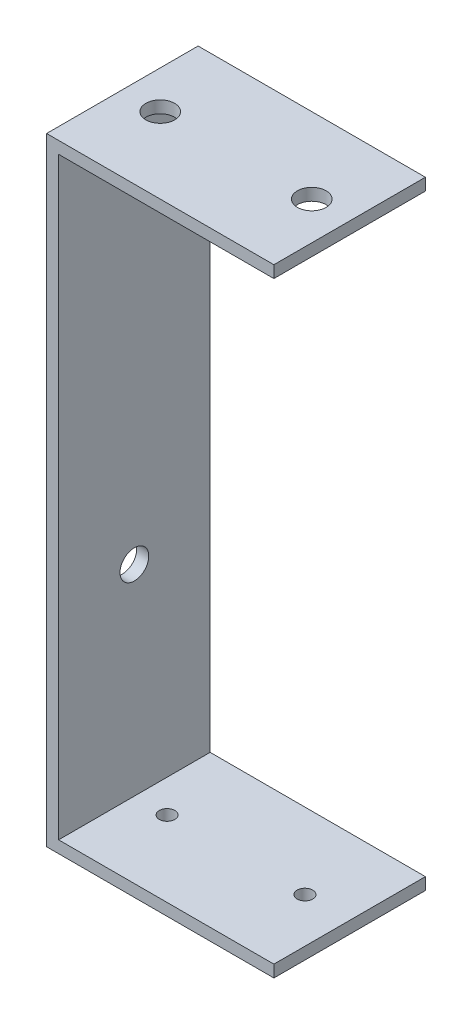
ISO-10303-21;
HEADER;
FILE_DESCRIPTION(('STEP AP214'),'2;1');
FILE_NAME('part.step','',(''),(''),'','','');
FILE_SCHEMA(('AUTOMOTIVE_DESIGN { 1 0 10303 214 1 1 1 1 }'));
ENDSEC;
DATA;
#1=APPLICATION_CONTEXT('core data for automotive mechanical design processes');
#2=APPLICATION_PROTOCOL_DEFINITION('international standard','automotive_design',2000,#1);
#3=PRODUCT_CONTEXT('',#1,'mechanical');
#4=PRODUCT('Part','Part','',(#3));
#5=PRODUCT_RELATED_PRODUCT_CATEGORY('part','',(#4));
#6=PRODUCT_DEFINITION_FORMATION('','',#4);
#7=PRODUCT_DEFINITION_CONTEXT('part definition',#1,'design');
#8=PRODUCT_DEFINITION('design','',#6,#7);
#9=PRODUCT_DEFINITION_SHAPE('','',#8);
#10=(LENGTH_UNIT() NAMED_UNIT(*) SI_UNIT(.MILLI.,.METRE.));
#11=(NAMED_UNIT(*) PLANE_ANGLE_UNIT() SI_UNIT($,.RADIAN.));
#12=(NAMED_UNIT(*) SI_UNIT($,.STERADIAN.) SOLID_ANGLE_UNIT());
#13=UNCERTAINTY_MEASURE_WITH_UNIT(LENGTH_MEASURE(1.E-05),#10,'distance_accuracy_value','');
#14=(GEOMETRIC_REPRESENTATION_CONTEXT(3) GLOBAL_UNCERTAINTY_ASSIGNED_CONTEXT((#13)) GLOBAL_UNIT_ASSIGNED_CONTEXT((#10,
#11,#12)) REPRESENTATION_CONTEXT('',''));
#15=CARTESIAN_POINT('',(0.,0.,0.));
#16=DIRECTION('',(0.,0.,1.));
#17=DIRECTION('',(1.,0.,0.));
#18=AXIS2_PLACEMENT_3D('',#15,#16,#17);
#19=CARTESIAN_POINT('',(30.,1.5875,20.));
#20=DIRECTION('',(0.,-1.,0.));
#21=DIRECTION('',(1.,0.,0.));
#22=AXIS2_PLACEMENT_3D('',#19,#20,#21);
#23=PLANE('',#22);
#24=DIRECTION('',(-1.,0.,0.));
#25=VECTOR('',#24,1.);
#26=CARTESIAN_POINT('',(30.,1.5875,0.));
#27=LINE('',#26,#25);
#28=CARTESIAN_POINT('',(30.,1.5875,0.));
#29=VERTEX_POINT('',#28);
#30=CARTESIAN_POINT('',(1.5875,1.5875,0.));
#31=VERTEX_POINT('',#30);
#32=EDGE_CURVE('E135',#29,#31,#27,.T.);
#33=ORIENTED_EDGE('',*,*,#32,.T.);
#34=DIRECTION('',(0.,0.,-1.));
#35=VECTOR('',#34,1.);
#36=CARTESIAN_POINT('',(1.5875,1.5875,20.));
#37=LINE('',#36,#35);
#38=CARTESIAN_POINT('',(1.5875,1.5875,20.));
#39=VERTEX_POINT('',#38);
#40=EDGE_CURVE('E44',#39,#31,#37,.T.);
#41=ORIENTED_EDGE('',*,*,#40,.F.);
#42=DIRECTION('',(-1.,0.,0.));
#43=VECTOR('',#42,1.);
#44=CARTESIAN_POINT('',(30.,1.5875,20.));
#45=LINE('',#44,#43);
#46=CARTESIAN_POINT('',(30.,1.5875,20.));
#47=VERTEX_POINT('',#46);
#48=EDGE_CURVE('E95',#47,#39,#45,.T.);
#49=ORIENTED_EDGE('',*,*,#48,.F.);
#50=DIRECTION('',(0.,0.,-1.));
#51=VECTOR('',#50,1.);
#52=CARTESIAN_POINT('',(30.,1.5875,20.));
#53=LINE('',#52,#51);
#54=EDGE_CURVE('E11',#47,#29,#53,.T.);
#55=ORIENTED_EDGE('',*,*,#54,.T.);
#56=EDGE_LOOP('',(#33,#41,#49,#55));
#57=FACE_BOUND('',#56,.T.);
#58=CARTESIAN_POINT('',(24.1,1.5875,10.));
#59=DIRECTION('',(0.,-1.,0.));
#60=DIRECTION('',(1.,0.,0.));
#61=AXIS2_PLACEMENT_3D('',#58,#59,#60);
#62=CIRCLE('',#61,1.0287);
#63=CARTESIAN_POINT('',(25.1287,1.5875,10.));
#64=VERTEX_POINT('',#63);
#65=EDGE_CURVE('E189',#64,#64,#62,.F.);
#66=ORIENTED_EDGE('',*,*,#65,.F.);
#67=EDGE_LOOP('',(#66));
#68=FACE_BOUND('',#67,.T.);
#69=CARTESIAN_POINT('',(5.9,1.5875,10.));
#70=DIRECTION('',(0.,-1.,0.));
#71=DIRECTION('',(1.,0.,0.));
#72=AXIS2_PLACEMENT_3D('',#69,#70,#71);
#73=CIRCLE('',#72,1.0287);
#74=CARTESIAN_POINT('',(6.9287,1.5875,10.));
#75=VERTEX_POINT('',#74);
#76=EDGE_CURVE('E195',#75,#75,#73,.F.);
#77=ORIENTED_EDGE('',*,*,#76,.F.);
#78=EDGE_LOOP('',(#77));
#79=FACE_BOUND('',#78,.T.);
#80=ADVANCED_FACE('F35',(#57,#68,#79),#23,.F.);
#81=CARTESIAN_POINT('',(30.,1.5875,20.));
#82=DIRECTION('',(-1.,0.,0.));
#83=DIRECTION('',(0.,0.,1.));
#84=AXIS2_PLACEMENT_3D('',#81,#82,#83);
#85=PLANE('',#84);
#86=DIRECTION('',(0.,1.,0.));
#87=VECTOR('',#86,1.);
#88=CARTESIAN_POINT('',(30.,1.5875,0.));
#89=LINE('',#88,#87);
#90=CARTESIAN_POINT('',(30.,0.,0.));
#91=VERTEX_POINT('',#90);
#92=EDGE_CURVE('E132',#91,#29,#89,.T.);
#93=ORIENTED_EDGE('',*,*,#92,.T.);
#94=ORIENTED_EDGE('',*,*,#54,.F.);
#95=DIRECTION('',(0.,1.,0.));
#96=VECTOR('',#95,1.);
#97=CARTESIAN_POINT('',(30.,1.5875,20.));
#98=LINE('',#97,#96);
#99=CARTESIAN_POINT('',(30.,0.,20.));
#100=VERTEX_POINT('',#99);
#101=EDGE_CURVE('E147',#100,#47,#98,.T.);
#102=ORIENTED_EDGE('',*,*,#101,.F.);
#103=DIRECTION('',(0.,0.,-1.));
#104=VECTOR('',#103,1.);
#105=CARTESIAN_POINT('',(30.,0.,20.));
#106=LINE('',#105,#104);
#107=EDGE_CURVE('E128',#100,#91,#106,.T.);
#108=ORIENTED_EDGE('',*,*,#107,.T.);
#109=EDGE_LOOP('',(#93,#94,#102,#108));
#110=FACE_BOUND('',#109,.T.);
#111=ADVANCED_FACE('F37',(#110),#85,.F.);
#112=CARTESIAN_POINT('',(1.5875,1.5875,20.));
#113=DIRECTION('',(-1.,0.,0.));
#114=DIRECTION('',(0.,0.,1.));
#115=AXIS2_PLACEMENT_3D('',#112,#113,#114);
#116=PLANE('',#115);
#117=CARTESIAN_POINT('',(1.5875,28.08,10.));
#118=DIRECTION('',(-1.,0.,0.));
#119=DIRECTION('',(0.,0.,1.));
#120=AXIS2_PLACEMENT_3D('',#117,#118,#119);
#121=CIRCLE('',#120,1.89865);
#122=CARTESIAN_POINT('',(1.5875,28.08,11.89865));
#123=VERTEX_POINT('',#122);
#124=EDGE_CURVE('E201',#123,#123,#121,.F.);
#125=ORIENTED_EDGE('',*,*,#124,.F.);
#126=EDGE_LOOP('',(#125));
#127=FACE_BOUND('',#126,.T.);
#128=DIRECTION('',(0.,1.,0.));
#129=VECTOR('',#128,1.);
#130=CARTESIAN_POINT('',(1.5875,1.5875,0.));
#131=LINE('',#130,#129);
#132=CARTESIAN_POINT('',(1.5875,79.9525,0.));
#133=VERTEX_POINT('',#132);
#134=EDGE_CURVE('E138',#31,#133,#131,.T.);
#135=ORIENTED_EDGE('',*,*,#134,.T.);
#136=DIRECTION('',(0.,0.,-1.));
#137=VECTOR('',#136,1.);
#138=CARTESIAN_POINT('',(1.5875,79.9525,20.));
#139=LINE('',#138,#137);
#140=CARTESIAN_POINT('',(1.5875,79.9525,20.));
#141=VERTEX_POINT('',#140);
#142=EDGE_CURVE('E154',#141,#133,#139,.T.);
#143=ORIENTED_EDGE('',*,*,#142,.F.);
#144=DIRECTION('',(0.,1.,0.));
#145=VECTOR('',#144,1.);
#146=CARTESIAN_POINT('',(1.5875,1.5875,20.));
#147=LINE('',#146,#145);
#148=EDGE_CURVE('E162',#39,#141,#147,.T.);
#149=ORIENTED_EDGE('',*,*,#148,.F.);
#150=ORIENTED_EDGE('',*,*,#40,.T.);
#151=EDGE_LOOP('',(#135,#143,#149,#150));
#152=FACE_BOUND('',#151,.T.);
#153=ADVANCED_FACE('F160',(#127,#152),#116,.F.);
#154=CARTESIAN_POINT('',(1.5875,79.9525,20.));
#155=DIRECTION('',(0.,1.,0.));
#156=DIRECTION('',(0.,0.,1.));
#157=AXIS2_PLACEMENT_3D('',#154,#155,#156);
#158=PLANE('',#157);
#159=CARTESIAN_POINT('',(5.,79.9525,10.));
#160=DIRECTION('',(0.,1.,0.));
#161=DIRECTION('',(0.,0.,1.));
#162=AXIS2_PLACEMENT_3D('',#159,#160,#161);
#163=CIRCLE('',#162,1.89864999999999);
#164=CARTESIAN_POINT('',(5.,79.9525,11.89865));
#165=VERTEX_POINT('',#164);
#166=EDGE_CURVE('E183',#165,#165,#163,.F.);
#167=ORIENTED_EDGE('',*,*,#166,.F.);
#168=EDGE_LOOP('',(#167));
#169=FACE_BOUND('',#168,.T.);
#170=CARTESIAN_POINT('',(25.,79.9525,10.));
#171=DIRECTION('',(0.,1.,0.));
#172=DIRECTION('',(0.,0.,1.));
#173=AXIS2_PLACEMENT_3D('',#170,#171,#172);
#174=CIRCLE('',#173,1.89864999999999);
#175=CARTESIAN_POINT('',(25.,79.9525,11.89865));
#176=VERTEX_POINT('',#175);
#177=EDGE_CURVE('E136',#176,#176,#174,.F.);
#178=ORIENTED_EDGE('',*,*,#177,.F.);
#179=EDGE_LOOP('',(#178));
#180=FACE_BOUND('',#179,.T.);
#181=DIRECTION('',(1.,0.,0.));
#182=VECTOR('',#181,1.);
#183=CARTESIAN_POINT('',(1.5875,79.9525,0.));
#184=LINE('',#183,#182);
#185=CARTESIAN_POINT('',(30.,79.9525,0.));
#186=VERTEX_POINT('',#185);
#187=EDGE_CURVE('E140',#133,#186,#184,.T.);
#188=ORIENTED_EDGE('',*,*,#187,.T.);
#189=DIRECTION('',(0.,0.,-1.));
#190=VECTOR('',#189,1.);
#191=CARTESIAN_POINT('',(30.,79.9525,20.));
#192=LINE('',#191,#190);
#193=CARTESIAN_POINT('',(30.,79.9525,20.));
#194=VERTEX_POINT('',#193);
#195=EDGE_CURVE('E151',#194,#186,#192,.T.);
#196=ORIENTED_EDGE('',*,*,#195,.F.);
#197=DIRECTION('',(1.,0.,0.));
#198=VECTOR('',#197,1.);
#199=CARTESIAN_POINT('',(1.5875,79.9525,20.));
#200=LINE('',#199,#198);
#201=EDGE_CURVE('E174',#141,#194,#200,.T.);
#202=ORIENTED_EDGE('',*,*,#201,.F.);
#203=ORIENTED_EDGE('',*,*,#142,.T.);
#204=EDGE_LOOP('',(#188,#196,#202,#203));
#205=FACE_BOUND('',#204,.T.);
#206=ADVANCED_FACE('F170',(#169,#180,#205),#158,.F.);
#207=CARTESIAN_POINT('',(30.,81.54,20.));
#208=DIRECTION('',(-1.,0.,0.));
#209=DIRECTION('',(0.,0.,1.));
#210=AXIS2_PLACEMENT_3D('',#207,#208,#209);
#211=PLANE('',#210);
#212=DIRECTION('',(0.,1.,0.));
#213=VECTOR('',#212,1.);
#214=CARTESIAN_POINT('',(30.,81.54,0.));
#215=LINE('',#214,#213);
#216=CARTESIAN_POINT('',(30.,81.54,0.));
#217=VERTEX_POINT('',#216);
#218=EDGE_CURVE('E142',#186,#217,#215,.T.);
#219=ORIENTED_EDGE('',*,*,#218,.T.);
#220=DIRECTION('',(0.,0.,-1.));
#221=VECTOR('',#220,1.);
#222=CARTESIAN_POINT('',(30.,81.54,20.));
#223=LINE('',#222,#221);
#224=CARTESIAN_POINT('',(30.,81.54,20.));
#225=VERTEX_POINT('',#224);
#226=EDGE_CURVE('E123',#225,#217,#223,.T.);
#227=ORIENTED_EDGE('',*,*,#226,.F.);
#228=DIRECTION('',(0.,1.,0.));
#229=VECTOR('',#228,1.);
#230=CARTESIAN_POINT('',(30.,81.54,20.));
#231=LINE('',#230,#229);
#232=EDGE_CURVE('E114',#194,#225,#231,.T.);
#233=ORIENTED_EDGE('',*,*,#232,.F.);
#234=ORIENTED_EDGE('',*,*,#195,.T.);
#235=EDGE_LOOP('',(#219,#227,#233,#234));
#236=FACE_BOUND('',#235,.T.);
#237=ADVANCED_FACE('F173',(#236),#211,.F.);
#238=CARTESIAN_POINT('',(0.,81.54,20.));
#239=DIRECTION('',(0.,-1.,0.));
#240=DIRECTION('',(0.,0.,-1.));
#241=AXIS2_PLACEMENT_3D('',#238,#239,#240);
#242=PLANE('',#241);
#243=CARTESIAN_POINT('',(5.,81.54,10.));
#244=DIRECTION('',(0.,1.,0.));
#245=DIRECTION('',(0.,0.,1.));
#246=AXIS2_PLACEMENT_3D('',#243,#244,#245);
#247=CIRCLE('',#246,1.89864999999999);
#248=CARTESIAN_POINT('',(5.,81.54,11.89865));
#249=VERTEX_POINT('',#248);
#250=EDGE_CURVE('E186',#249,#249,#247,.T.);
#251=ORIENTED_EDGE('',*,*,#250,.F.);
#252=EDGE_LOOP('',(#251));
#253=FACE_BOUND('',#252,.T.);
#254=CARTESIAN_POINT('',(25.,81.54,10.));
#255=DIRECTION('',(0.,1.,0.));
#256=DIRECTION('',(0.,0.,1.));
#257=AXIS2_PLACEMENT_3D('',#254,#255,#256);
#258=CIRCLE('',#257,1.89864999999999);
#259=CARTESIAN_POINT('',(25.,81.54,11.89865));
#260=VERTEX_POINT('',#259);
#261=EDGE_CURVE('E180',#260,#260,#258,.T.);
#262=ORIENTED_EDGE('',*,*,#261,.F.);
#263=EDGE_LOOP('',(#262));
#264=FACE_BOUND('',#263,.T.);
#265=DIRECTION('',(-1.,0.,0.));
#266=VECTOR('',#265,1.);
#267=CARTESIAN_POINT('',(0.,81.54,0.));
#268=LINE('',#267,#266);
#269=CARTESIAN_POINT('',(0.,81.54,0.));
#270=VERTEX_POINT('',#269);
#271=EDGE_CURVE('E122',#217,#270,#268,.T.);
#272=ORIENTED_EDGE('',*,*,#271,.T.);
#273=DIRECTION('',(0.,0.,-1.));
#274=VECTOR('',#273,1.);
#275=CARTESIAN_POINT('',(0.,81.54,20.));
#276=LINE('',#275,#274);
#277=CARTESIAN_POINT('',(0.,81.54,20.));
#278=VERTEX_POINT('',#277);
#279=EDGE_CURVE('E119',#278,#270,#276,.T.);
#280=ORIENTED_EDGE('',*,*,#279,.F.);
#281=DIRECTION('',(-1.,0.,0.));
#282=VECTOR('',#281,1.);
#283=CARTESIAN_POINT('',(0.,81.54,20.));
#284=LINE('',#283,#282);
#285=EDGE_CURVE('E108',#225,#278,#284,.T.);
#286=ORIENTED_EDGE('',*,*,#285,.F.);
#287=ORIENTED_EDGE('',*,*,#226,.T.);
#288=EDGE_LOOP('',(#272,#280,#286,#287));
#289=FACE_BOUND('',#288,.T.);
#290=ADVANCED_FACE('F120',(#253,#264,#289),#242,.F.);
#291=CARTESIAN_POINT('',(0.,0.,20.));
#292=DIRECTION('',(1.,0.,0.));
#293=DIRECTION('',(0.,0.,-1.));
#294=AXIS2_PLACEMENT_3D('',#291,#292,#293);
#295=PLANE('',#294);
#296=CARTESIAN_POINT('',(0.,28.08,10.));
#297=DIRECTION('',(-1.,0.,0.));
#298=DIRECTION('',(0.,0.,1.));
#299=AXIS2_PLACEMENT_3D('',#296,#297,#298);
#300=CIRCLE('',#299,1.89865);
#301=CARTESIAN_POINT('',(0.,28.08,11.89865));
#302=VERTEX_POINT('',#301);
#303=EDGE_CURVE('E204',#302,#302,#300,.T.);
#304=ORIENTED_EDGE('',*,*,#303,.F.);
#305=EDGE_LOOP('',(#304));
#306=FACE_BOUND('',#305,.T.);
#307=DIRECTION('',(0.,-1.,0.));
#308=VECTOR('',#307,1.);
#309=CARTESIAN_POINT('',(0.,0.,0.));
#310=LINE('',#309,#308);
#311=CARTESIAN_POINT('',(0.,0.,0.));
#312=VERTEX_POINT('',#311);
#313=EDGE_CURVE('E81',#270,#312,#310,.T.);
#314=ORIENTED_EDGE('',*,*,#313,.T.);
#315=DIRECTION('',(0.,0.,-1.));
#316=VECTOR('',#315,1.);
#317=CARTESIAN_POINT('',(0.,0.,20.));
#318=LINE('',#317,#316);
#319=CARTESIAN_POINT('',(0.,0.,20.));
#320=VERTEX_POINT('',#319);
#321=EDGE_CURVE('E124',#320,#312,#318,.T.);
#322=ORIENTED_EDGE('',*,*,#321,.F.);
#323=DIRECTION('',(0.,-1.,0.));
#324=VECTOR('',#323,1.);
#325=CARTESIAN_POINT('',(0.,0.,20.));
#326=LINE('',#325,#324);
#327=EDGE_CURVE('E112',#278,#320,#326,.T.);
#328=ORIENTED_EDGE('',*,*,#327,.F.);
#329=ORIENTED_EDGE('',*,*,#279,.T.);
#330=EDGE_LOOP('',(#314,#322,#328,#329));
#331=FACE_BOUND('',#330,.T.);
#332=ADVANCED_FACE('F126',(#306,#331),#295,.F.);
#333=CARTESIAN_POINT('',(30.,0.,20.));
#334=DIRECTION('',(0.,1.,0.));
#335=DIRECTION('',(-1.,0.,0.));
#336=AXIS2_PLACEMENT_3D('',#333,#334,#335);
#337=PLANE('',#336);
#338=CARTESIAN_POINT('',(5.9,0.,10.));
#339=DIRECTION('',(0.,-1.,0.));
#340=DIRECTION('',(0.,0.,-1.));
#341=AXIS2_PLACEMENT_3D('',#338,#339,#340);
#342=CIRCLE('',#341,1.0287);
#343=CARTESIAN_POINT('',(5.9,0.,8.9713));
#344=VERTEX_POINT('',#343);
#345=EDGE_CURVE('E198',#344,#344,#342,.T.);
#346=ORIENTED_EDGE('',*,*,#345,.F.);
#347=EDGE_LOOP('',(#346));
#348=FACE_BOUND('',#347,.T.);
#349=CARTESIAN_POINT('',(24.1,0.,10.));
#350=DIRECTION('',(0.,-1.,0.));
#351=DIRECTION('',(0.,0.,-1.));
#352=AXIS2_PLACEMENT_3D('',#349,#350,#351);
#353=CIRCLE('',#352,1.0287);
#354=CARTESIAN_POINT('',(24.1,0.,8.9713));
#355=VERTEX_POINT('',#354);
#356=EDGE_CURVE('E192',#355,#355,#353,.T.);
#357=ORIENTED_EDGE('',*,*,#356,.F.);
#358=EDGE_LOOP('',(#357));
#359=FACE_BOUND('',#358,.T.);
#360=DIRECTION('',(1.,0.,0.));
#361=VECTOR('',#360,1.);
#362=CARTESIAN_POINT('',(30.,0.,0.));
#363=LINE('',#362,#361);
#364=EDGE_CURVE('E87',#312,#91,#363,.T.);
#365=ORIENTED_EDGE('',*,*,#364,.T.);
#366=ORIENTED_EDGE('',*,*,#107,.F.);
#367=DIRECTION('',(1.,0.,0.));
#368=VECTOR('',#367,1.);
#369=CARTESIAN_POINT('',(30.,0.,20.));
#370=LINE('',#369,#368);
#371=EDGE_CURVE('E52',#320,#100,#370,.T.);
#372=ORIENTED_EDGE('',*,*,#371,.F.);
#373=ORIENTED_EDGE('',*,*,#321,.T.);
#374=EDGE_LOOP('',(#365,#366,#372,#373));
#375=FACE_BOUND('',#374,.T.);
#376=ADVANCED_FACE('F237',(#348,#359,#375),#337,.F.);
#377=CARTESIAN_POINT('',(0.,0.,20.));
#378=DIRECTION('',(0.,0.,-1.));
#379=DIRECTION('',(-1.,0.,0.));
#380=AXIS2_PLACEMENT_3D('',#377,#378,#379);
#381=PLANE('',#380);
#382=ORIENTED_EDGE('',*,*,#101,.T.);
#383=ORIENTED_EDGE('',*,*,#48,.T.);
#384=ORIENTED_EDGE('',*,*,#148,.T.);
#385=ORIENTED_EDGE('',*,*,#201,.T.);
#386=ORIENTED_EDGE('',*,*,#232,.T.);
#387=ORIENTED_EDGE('',*,*,#285,.T.);
#388=ORIENTED_EDGE('',*,*,#327,.T.);
#389=ORIENTED_EDGE('',*,*,#371,.T.);
#390=EDGE_LOOP('',(#382,#383,#384,#385,#386,#387,#388,#389));
#391=FACE_BOUND('',#390,.T.);
#392=ADVANCED_FACE('F110',(#391),#381,.F.);
#393=CARTESIAN_POINT('',(0.,0.,0.));
#394=DIRECTION('',(0.,0.,-1.));
#395=DIRECTION('',(-1.,0.,0.));
#396=AXIS2_PLACEMENT_3D('',#393,#394,#395);
#397=PLANE('',#396);
#398=ORIENTED_EDGE('',*,*,#92,.F.);
#399=ORIENTED_EDGE('',*,*,#364,.F.);
#400=ORIENTED_EDGE('',*,*,#313,.F.);
#401=ORIENTED_EDGE('',*,*,#271,.F.);
#402=ORIENTED_EDGE('',*,*,#218,.F.);
#403=ORIENTED_EDGE('',*,*,#187,.F.);
#404=ORIENTED_EDGE('',*,*,#134,.F.);
#405=ORIENTED_EDGE('',*,*,#32,.F.);
#406=EDGE_LOOP('',(#398,#399,#400,#401,#402,#403,#404,#405));
#407=FACE_BOUND('',#406,.T.);
#408=ADVANCED_FACE('F166',(#407),#397,.T.);
#409=CARTESIAN_POINT('',(25.,81.54,10.));
#410=DIRECTION('',(0.,1.,0.));
#411=DIRECTION('',(0.,0.,1.));
#412=AXIS2_PLACEMENT_3D('',#409,#410,#411);
#413=CYLINDRICAL_SURFACE('',#412,1.89864999999999);
#414=ORIENTED_EDGE('',*,*,#177,.T.);
#415=EDGE_LOOP('',(#414));
#416=FACE_BOUND('',#415,.T.);
#417=ORIENTED_EDGE('',*,*,#261,.T.);
#418=EDGE_LOOP('',(#417));
#419=FACE_BOUND('',#418,.T.);
#420=ADVANCED_FACE('F250',(#416,#419),#413,.F.);
#421=CARTESIAN_POINT('',(5.,81.54,10.));
#422=DIRECTION('',(0.,1.,0.));
#423=DIRECTION('',(0.,0.,1.));
#424=AXIS2_PLACEMENT_3D('',#421,#422,#423);
#425=CYLINDRICAL_SURFACE('',#424,1.89864999999999);
#426=ORIENTED_EDGE('',*,*,#166,.T.);
#427=EDGE_LOOP('',(#426));
#428=FACE_BOUND('',#427,.T.);
#429=ORIENTED_EDGE('',*,*,#250,.T.);
#430=EDGE_LOOP('',(#429));
#431=FACE_BOUND('',#430,.T.);
#432=ADVANCED_FACE('F244',(#428,#431),#425,.F.);
#433=CARTESIAN_POINT('',(24.1,0.,10.));
#434=DIRECTION('',(0.,-1.,0.));
#435=DIRECTION('',(0.,0.,-1.));
#436=AXIS2_PLACEMENT_3D('',#433,#434,#435);
#437=CYLINDRICAL_SURFACE('',#436,1.0287);
#438=ORIENTED_EDGE('',*,*,#65,.T.);
#439=EDGE_LOOP('',(#438));
#440=FACE_BOUND('',#439,.T.);
#441=ORIENTED_EDGE('',*,*,#356,.T.);
#442=EDGE_LOOP('',(#441));
#443=FACE_BOUND('',#442,.T.);
#444=ADVANCED_FACE('F233',(#440,#443),#437,.F.);
#445=CARTESIAN_POINT('',(5.9,0.,10.));
#446=DIRECTION('',(0.,-1.,0.));
#447=DIRECTION('',(0.,0.,-1.));
#448=AXIS2_PLACEMENT_3D('',#445,#446,#447);
#449=CYLINDRICAL_SURFACE('',#448,1.0287);
#450=ORIENTED_EDGE('',*,*,#76,.T.);
#451=EDGE_LOOP('',(#450));
#452=FACE_BOUND('',#451,.T.);
#453=ORIENTED_EDGE('',*,*,#345,.T.);
#454=EDGE_LOOP('',(#453));
#455=FACE_BOUND('',#454,.T.);
#456=ADVANCED_FACE('F230',(#452,#455),#449,.F.);
#457=CARTESIAN_POINT('',(0.,28.08,10.));
#458=DIRECTION('',(-1.,0.,0.));
#459=DIRECTION('',(0.,0.,1.));
#460=AXIS2_PLACEMENT_3D('',#457,#458,#459);
#461=CYLINDRICAL_SURFACE('',#460,1.89865);
#462=ORIENTED_EDGE('',*,*,#124,.T.);
#463=EDGE_LOOP('',(#462));
#464=FACE_BOUND('',#463,.T.);
#465=ORIENTED_EDGE('',*,*,#303,.T.);
#466=EDGE_LOOP('',(#465));
#467=FACE_BOUND('',#466,.T.);
#468=ADVANCED_FACE('F210',(#464,#467),#461,.F.);
#469=CLOSED_SHELL('',(#80,#111,#153,#206,#237,#290,#332,#376,#392,#408,#420,#432,#444,#456,#468));
#470=MANIFOLD_SOLID_BREP('B2',#469);
#471=ADVANCED_BREP_SHAPE_REPRESENTATION('',(#18,#470),#14);
#472=SHAPE_DEFINITION_REPRESENTATION(#9,#471);
ENDSEC;
END-ISO-10303-21;
